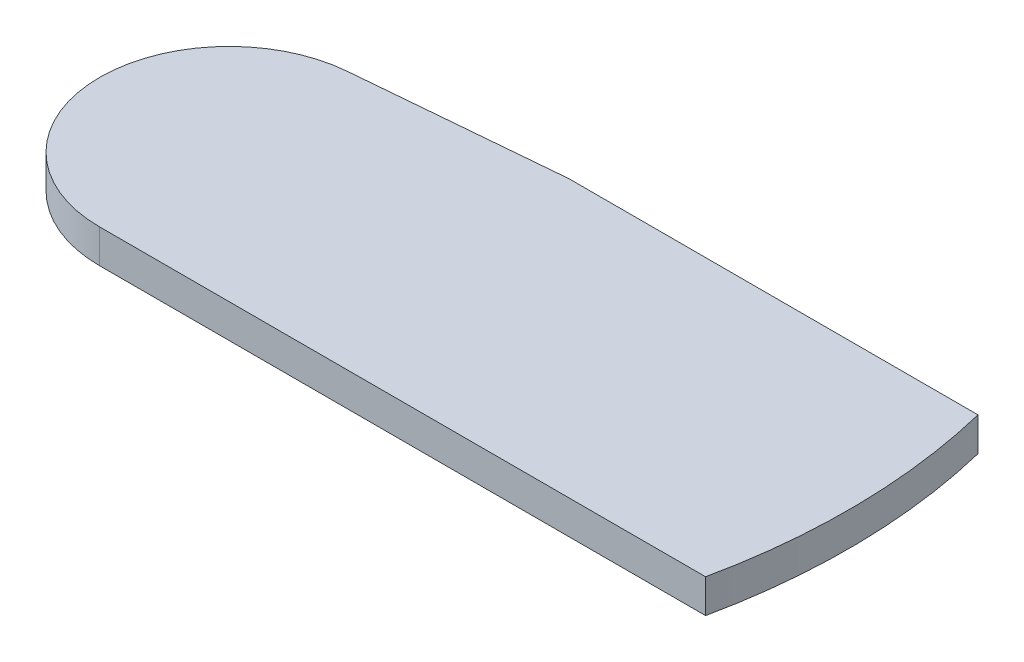
ISO-10303-21;
HEADER;
FILE_DESCRIPTION(('STEP AP214'),'2;1');
FILE_NAME('part.step','',(''),(''),'','','');
FILE_SCHEMA(('AUTOMOTIVE_DESIGN { 1 0 10303 214 1 1 1 1 }'));
ENDSEC;
DATA;
#1=APPLICATION_CONTEXT('core data for automotive mechanical design processes');
#2=APPLICATION_PROTOCOL_DEFINITION('international standard','automotive_design',2000,#1);
#3=PRODUCT_CONTEXT('',#1,'mechanical');
#4=PRODUCT('Part','Part','',(#3));
#5=PRODUCT_RELATED_PRODUCT_CATEGORY('part','',(#4));
#6=PRODUCT_DEFINITION_FORMATION('','',#4);
#7=PRODUCT_DEFINITION_CONTEXT('part definition',#1,'design');
#8=PRODUCT_DEFINITION('design','',#6,#7);
#9=PRODUCT_DEFINITION_SHAPE('','',#8);
#10=(LENGTH_UNIT() NAMED_UNIT(*) SI_UNIT(.MILLI.,.METRE.));
#11=(NAMED_UNIT(*) PLANE_ANGLE_UNIT() SI_UNIT($,.RADIAN.));
#12=(NAMED_UNIT(*) SI_UNIT($,.STERADIAN.) SOLID_ANGLE_UNIT());
#13=UNCERTAINTY_MEASURE_WITH_UNIT(LENGTH_MEASURE(1.E-05),#10,'distance_accuracy_value','');
#14=(GEOMETRIC_REPRESENTATION_CONTEXT(3) GLOBAL_UNCERTAINTY_ASSIGNED_CONTEXT((#13)) GLOBAL_UNIT_ASSIGNED_CONTEXT((#10,
#11,#12)) REPRESENTATION_CONTEXT('',''));
#15=CARTESIAN_POINT('',(0.,0.,0.));
#16=DIRECTION('',(0.,0.,1.));
#17=DIRECTION('',(1.,0.,0.));
#18=AXIS2_PLACEMENT_3D('',#15,#16,#17);
#19=CARTESIAN_POINT('',(-44.4629884463721,2.6,0.));
#20=DIRECTION('',(0.,-1.,0.));
#21=DIRECTION('',(0.,0.,-1.));
#22=AXIS2_PLACEMENT_3D('',#19,#20,#21);
#23=CYLINDRICAL_SURFACE('',#22,10.);
#24=CARTESIAN_POINT('',(-44.4629884463721,0.,0.));
#25=DIRECTION('',(0.,1.,0.));
#26=DIRECTION('',(0.,0.,1.));
#27=AXIS2_PLACEMENT_3D('',#24,#25,#26);
#28=CIRCLE('',#27,10.);
#29=CARTESIAN_POINT('',(-45.3354976929769,0.,-9.96186366171457));
#30=VERTEX_POINT('',#29);
#31=CARTESIAN_POINT('',(-44.4629884463721,0.,10.));
#32=VERTEX_POINT('',#31);
#33=EDGE_CURVE('E110',#30,#32,#28,.T.);
#34=ORIENTED_EDGE('',*,*,#33,.T.);
#35=DIRECTION('',(0.,-1.,0.));
#36=VECTOR('',#35,1.);
#37=CARTESIAN_POINT('',(-44.4629884463721,2.6,10.));
#38=LINE('',#37,#36);
#39=CARTESIAN_POINT('',(-44.4629884463721,2.6,10.));
#40=VERTEX_POINT('',#39);
#41=EDGE_CURVE('E11',#40,#32,#38,.T.);
#42=ORIENTED_EDGE('',*,*,#41,.F.);
#43=CARTESIAN_POINT('',(-44.4629884463721,2.6,0.));
#44=DIRECTION('',(0.,1.,0.));
#45=DIRECTION('',(0.,0.,1.));
#46=AXIS2_PLACEMENT_3D('',#43,#44,#45);
#47=CIRCLE('',#46,10.);
#48=CARTESIAN_POINT('',(-45.3354976929769,2.6,-9.96186366171457));
#49=VERTEX_POINT('',#48);
#50=EDGE_CURVE('E120',#49,#40,#47,.T.);
#51=ORIENTED_EDGE('',*,*,#50,.F.);
#52=DIRECTION('',(0.,-1.,0.));
#53=VECTOR('',#52,1.);
#54=CARTESIAN_POINT('',(-45.3354976929769,2.6,-9.96186366171457));
#55=LINE('',#54,#53);
#56=EDGE_CURVE('E51',#49,#30,#55,.T.);
#57=ORIENTED_EDGE('',*,*,#56,.T.);
#58=EDGE_LOOP('',(#34,#42,#51,#57));
#59=FACE_BOUND('',#58,.T.);
#60=ADVANCED_FACE('F35',(#59),#23,.T.);
#61=CARTESIAN_POINT('',(0.,2.6,10.));
#62=DIRECTION('',(0.,0.,-1.));
#63=DIRECTION('',(-1.,0.,0.));
#64=AXIS2_PLACEMENT_3D('',#61,#62,#63);
#65=PLANE('',#64);
#66=DIRECTION('',(1.,0.,0.));
#67=VECTOR('',#66,1.);
#68=CARTESIAN_POINT('',(0.,0.,10.));
#69=LINE('',#68,#67);
#70=CARTESIAN_POINT('',(2.32309716482568,0.,10.));
#71=VERTEX_POINT('',#70);
#72=EDGE_CURVE('E112',#32,#71,#69,.T.);
#73=ORIENTED_EDGE('',*,*,#72,.T.);
#74=DIRECTION('',(0.,-1.,0.));
#75=VECTOR('',#74,1.);
#76=CARTESIAN_POINT('',(2.32309716482568,2.6,10.));
#77=LINE('',#76,#75);
#78=CARTESIAN_POINT('',(2.32309716482568,2.6,10.));
#79=VERTEX_POINT('',#78);
#80=EDGE_CURVE('E43',#79,#71,#77,.T.);
#81=ORIENTED_EDGE('',*,*,#80,.F.);
#82=DIRECTION('',(1.,0.,0.));
#83=VECTOR('',#82,1.);
#84=CARTESIAN_POINT('',(0.,2.6,10.));
#85=LINE('',#84,#83);
#86=EDGE_CURVE('E80',#40,#79,#85,.T.);
#87=ORIENTED_EDGE('',*,*,#86,.F.);
#88=ORIENTED_EDGE('',*,*,#41,.T.);
#89=EDGE_LOOP('',(#73,#81,#87,#88));
#90=FACE_BOUND('',#89,.T.);
#91=ADVANCED_FACE('F135',(#90),#65,.F.);
#92=CARTESIAN_POINT('',(-44.4629884463721,2.6,0.));
#93=DIRECTION('',(0.,-1.,0.));
#94=DIRECTION('',(0.,0.,-1.));
#95=AXIS2_PLACEMENT_3D('',#92,#93,#94);
#96=CYLINDRICAL_SURFACE('',#95,47.8428448863393);
#97=CARTESIAN_POINT('',(-44.4629884463721,0.,0.));
#98=DIRECTION('',(0.,1.,0.));
#99=DIRECTION('',(0.,0.,1.));
#100=AXIS2_PLACEMENT_3D('',#97,#98,#99);
#101=CIRCLE('',#100,47.8428448863393);
#102=CARTESIAN_POINT('',(2.01573646590297,0.,-11.3431008700174));
#103=VERTEX_POINT('',#102);
#104=EDGE_CURVE('E100',#71,#103,#101,.T.);
#105=ORIENTED_EDGE('',*,*,#104,.T.);
#106=DIRECTION('',(0.,-1.,0.));
#107=VECTOR('',#106,1.);
#108=CARTESIAN_POINT('',(2.01573646590297,2.6,-11.3431008700174));
#109=LINE('',#108,#107);
#110=CARTESIAN_POINT('',(2.01573646590297,2.6,-11.3431008700174));
#111=VERTEX_POINT('',#110);
#112=EDGE_CURVE('E97',#111,#103,#109,.T.);
#113=ORIENTED_EDGE('',*,*,#112,.F.);
#114=CARTESIAN_POINT('',(-44.4629884463721,2.6,0.));
#115=DIRECTION('',(0.,1.,0.));
#116=DIRECTION('',(0.,0.,1.));
#117=AXIS2_PLACEMENT_3D('',#114,#115,#116);
#118=CIRCLE('',#117,47.8428448863393);
#119=EDGE_CURVE('E87',#79,#111,#118,.T.);
#120=ORIENTED_EDGE('',*,*,#119,.F.);
#121=ORIENTED_EDGE('',*,*,#80,.T.);
#122=EDGE_LOOP('',(#105,#113,#120,#121));
#123=FACE_BOUND('',#122,.T.);
#124=ADVANCED_FACE('F98',(#123),#96,.T.);
#125=CARTESIAN_POINT('',(0.,2.6,-11.3431008700174));
#126=DIRECTION('',(0.,0.,-1.));
#127=DIRECTION('',(-1.,0.,0.));
#128=AXIS2_PLACEMENT_3D('',#125,#126,#127);
#129=PLANE('',#128);
#130=DIRECTION('',(1.,0.,0.));
#131=VECTOR('',#130,1.);
#132=CARTESIAN_POINT('',(0.,0.,-11.3431008700174));
#133=LINE('',#132,#131);
#134=CARTESIAN_POINT('',(-29.5652387448419,0.,-11.3431008700174));
#135=VERTEX_POINT('',#134);
#136=EDGE_CURVE('E115',#135,#103,#133,.T.);
#137=ORIENTED_EDGE('',*,*,#136,.F.);
#138=DIRECTION('',(0.,-1.,0.));
#139=VECTOR('',#138,1.);
#140=CARTESIAN_POINT('',(-29.5652387448419,2.6,-11.3431008700174));
#141=LINE('',#140,#139);
#142=CARTESIAN_POINT('',(-29.5652387448419,2.6,-11.3431008700174));
#143=VERTEX_POINT('',#142);
#144=EDGE_CURVE('E68',#143,#135,#141,.T.);
#145=ORIENTED_EDGE('',*,*,#144,.F.);
#146=DIRECTION('',(1.,0.,0.));
#147=VECTOR('',#146,1.);
#148=CARTESIAN_POINT('',(0.,2.6,-11.3431008700174));
#149=LINE('',#148,#147);
#150=EDGE_CURVE('E92',#143,#111,#149,.T.);
#151=ORIENTED_EDGE('',*,*,#150,.T.);
#152=ORIENTED_EDGE('',*,*,#112,.T.);
#153=EDGE_LOOP('',(#137,#145,#151,#152));
#154=FACE_BOUND('',#153,.T.);
#155=ADVANCED_FACE('F104',(#154),#129,.T.);
#156=CARTESIAN_POINT('',(-1.21099369937548,2.6,-13.8265057652025));
#157=DIRECTION('',(-0.087250924660481,0.,-0.996186366171457));
#158=DIRECTION('',(-0.996186366171457,0.,0.087250924660481));
#159=AXIS2_PLACEMENT_3D('',#156,#157,#158);
#160=PLANE('',#159);
#161=DIRECTION('',(0.996186366171457,0.,-0.087250924660481));
#162=VECTOR('',#161,1.);
#163=CARTESIAN_POINT('',(-1.21099369937548,0.,-13.8265057652025));
#164=LINE('',#163,#162);
#165=EDGE_CURVE('E117',#30,#135,#164,.T.);
#166=ORIENTED_EDGE('',*,*,#165,.F.);
#167=ORIENTED_EDGE('',*,*,#56,.F.);
#168=DIRECTION('',(0.996186366171457,0.,-0.087250924660481));
#169=VECTOR('',#168,1.);
#170=CARTESIAN_POINT('',(-1.21099369937548,2.6,-13.8265057652025));
#171=LINE('',#170,#169);
#172=EDGE_CURVE('E105',#49,#143,#171,.T.);
#173=ORIENTED_EDGE('',*,*,#172,.T.);
#174=ORIENTED_EDGE('',*,*,#144,.T.);
#175=EDGE_LOOP('',(#166,#167,#173,#174));
#176=FACE_BOUND('',#175,.T.);
#177=ADVANCED_FACE('F124',(#176),#160,.T.);
#178=CARTESIAN_POINT('',(0.,2.6,0.));
#179=DIRECTION('',(0.,1.,0.));
#180=DIRECTION('',(0.,0.,1.));
#181=AXIS2_PLACEMENT_3D('',#178,#179,#180);
#182=PLANE('',#181);
#183=ORIENTED_EDGE('',*,*,#50,.T.);
#184=ORIENTED_EDGE('',*,*,#86,.T.);
#185=ORIENTED_EDGE('',*,*,#119,.T.);
#186=ORIENTED_EDGE('',*,*,#150,.F.);
#187=ORIENTED_EDGE('',*,*,#172,.F.);
#188=EDGE_LOOP('',(#183,#184,#185,#186,#187));
#189=FACE_BOUND('',#188,.T.);
#190=ADVANCED_FACE('F89',(#189),#182,.T.);
#191=CARTESIAN_POINT('',(0.,0.,0.));
#192=DIRECTION('',(0.,1.,0.));
#193=DIRECTION('',(0.,0.,1.));
#194=AXIS2_PLACEMENT_3D('',#191,#192,#193);
#195=PLANE('',#194);
#196=ORIENTED_EDGE('',*,*,#33,.F.);
#197=ORIENTED_EDGE('',*,*,#165,.T.);
#198=ORIENTED_EDGE('',*,*,#136,.T.);
#199=ORIENTED_EDGE('',*,*,#104,.F.);
#200=ORIENTED_EDGE('',*,*,#72,.F.);
#201=EDGE_LOOP('',(#196,#197,#198,#199,#200));
#202=FACE_BOUND('',#201,.T.);
#203=ADVANCED_FACE('F123',(#202),#195,.F.);
#204=CLOSED_SHELL('',(#60,#91,#124,#155,#177,#190,#203));
#205=MANIFOLD_SOLID_BREP('B2',#204);
#206=ADVANCED_BREP_SHAPE_REPRESENTATION('',(#18,#205),#14);
#207=SHAPE_DEFINITION_REPRESENTATION(#9,#206);
ENDSEC;
END-ISO-10303-21;
